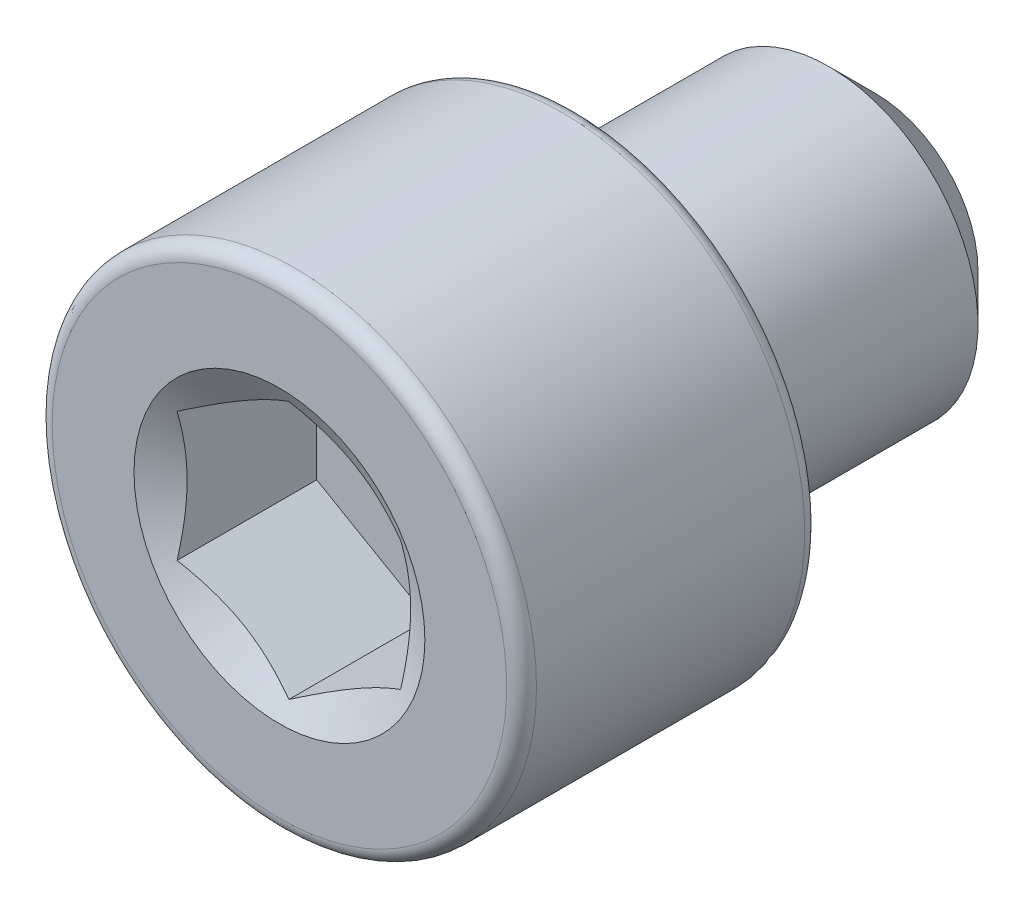
ISO-10303-21;
HEADER;
FILE_DESCRIPTION(('STEP AP214'),'2;1');
FILE_NAME('part.step','',(''),(''),'','','');
FILE_SCHEMA(('AUTOMOTIVE_DESIGN { 1 0 10303 214 1 1 1 1 }'));
ENDSEC;
DATA;
#1=APPLICATION_CONTEXT('core data for automotive mechanical design processes');
#2=APPLICATION_PROTOCOL_DEFINITION('international standard','automotive_design',2000,#1);
#3=PRODUCT_CONTEXT('',#1,'mechanical');
#4=PRODUCT('Part','Part','',(#3));
#5=PRODUCT_RELATED_PRODUCT_CATEGORY('part','',(#4));
#6=PRODUCT_DEFINITION_FORMATION('','',#4);
#7=PRODUCT_DEFINITION_CONTEXT('part definition',#1,'design');
#8=PRODUCT_DEFINITION('design','',#6,#7);
#9=PRODUCT_DEFINITION_SHAPE('','',#8);
#10=(LENGTH_UNIT() NAMED_UNIT(*) SI_UNIT(.MILLI.,.METRE.));
#11=(NAMED_UNIT(*) PLANE_ANGLE_UNIT() SI_UNIT($,.RADIAN.));
#12=(NAMED_UNIT(*) SI_UNIT($,.STERADIAN.) SOLID_ANGLE_UNIT());
#13=UNCERTAINTY_MEASURE_WITH_UNIT(LENGTH_MEASURE(1.E-05),#10,'distance_accuracy_value','');
#14=(GEOMETRIC_REPRESENTATION_CONTEXT(3) GLOBAL_UNCERTAINTY_ASSIGNED_CONTEXT((#13)) GLOBAL_UNIT_ASSIGNED_CONTEXT((#10,
#11,#12)) REPRESENTATION_CONTEXT('',''));
#15=CARTESIAN_POINT('',(0.,0.,0.));
#16=DIRECTION('',(0.,0.,1.));
#17=DIRECTION('',(1.,0.,0.));
#18=AXIS2_PLACEMENT_3D('',#15,#16,#17);
#19=CARTESIAN_POINT('',(0.,0.,-8.));
#20=DIRECTION('',(0.,0.,-1.));
#21=DIRECTION('',(-1.,0.,0.));
#22=AXIS2_PLACEMENT_3D('',#19,#20,#21);
#23=PLANE('',#22);
#24=CARTESIAN_POINT('',(0.,0.,-8.));
#25=DIRECTION('',(0.,0.,-1.));
#26=DIRECTION('',(-1.,0.,0.));
#27=AXIS2_PLACEMENT_3D('',#24,#25,#26);
#28=CIRCLE('',#27,2.75);
#29=CARTESIAN_POINT('',(-2.75,0.,-8.));
#30=VERTEX_POINT('',#29);
#31=EDGE_CURVE('E56',#30,#30,#28,.T.);
#32=ORIENTED_EDGE('',*,*,#31,.T.);
#33=EDGE_LOOP('',(#32));
#34=FACE_BOUND('',#33,.T.);
#35=ADVANCED_FACE('F43',(#34),#23,.T.);
#36=CARTESIAN_POINT('',(0.,0.,-8.));
#37=DIRECTION('',(0.,0.,1.));
#38=DIRECTION('',(1.,0.,0.));
#39=AXIS2_PLACEMENT_3D('',#36,#37,#38);
#40=CONICAL_SURFACE('',#39,2.75,0.785398163397449);
#41=CARTESIAN_POINT('',(0.,0.,-6.75));
#42=DIRECTION('',(0.,0.,-1.));
#43=DIRECTION('',(-1.,0.,0.));
#44=AXIS2_PLACEMENT_3D('',#41,#42,#43);
#45=CIRCLE('',#44,4.);
#46=CARTESIAN_POINT('',(-4.,0.,-6.75));
#47=VERTEX_POINT('',#46);
#48=EDGE_CURVE('E141',#47,#47,#45,.T.);
#49=ORIENTED_EDGE('',*,*,#48,.T.);
#50=EDGE_LOOP('',(#49));
#51=FACE_BOUND('',#50,.T.);
#52=ORIENTED_EDGE('',*,*,#31,.F.);
#53=EDGE_LOOP('',(#52));
#54=FACE_BOUND('',#53,.T.);
#55=ADVANCED_FACE('F147',(#51,#54),#40,.T.);
#56=CARTESIAN_POINT('',(0.,0.,-8.));
#57=DIRECTION('',(0.,0.,-1.));
#58=DIRECTION('',(-1.,0.,0.));
#59=AXIS2_PLACEMENT_3D('',#56,#57,#58);
#60=CYLINDRICAL_SURFACE('',#59,4.);
#61=CARTESIAN_POINT('',(0.,0.,0.));
#62=DIRECTION('',(0.,0.,-1.));
#63=DIRECTION('',(-1.,0.,0.));
#64=AXIS2_PLACEMENT_3D('',#61,#62,#63);
#65=CIRCLE('',#64,4.);
#66=CARTESIAN_POINT('',(-4.,0.,0.));
#67=VERTEX_POINT('',#66);
#68=EDGE_CURVE('E138',#67,#67,#65,.T.);
#69=ORIENTED_EDGE('',*,*,#68,.T.);
#70=EDGE_LOOP('',(#69));
#71=FACE_BOUND('',#70,.T.);
#72=ORIENTED_EDGE('',*,*,#48,.F.);
#73=EDGE_LOOP('',(#72));
#74=FACE_BOUND('',#73,.T.);
#75=ADVANCED_FACE('F149',(#71,#74),#60,.T.);
#76=CARTESIAN_POINT('',(0.,4.,0.));
#77=DIRECTION('',(0.,0.,-1.));
#78=DIRECTION('',(-1.,0.,0.));
#79=AXIS2_PLACEMENT_3D('',#76,#77,#78);
#80=PLANE('',#79);
#81=CARTESIAN_POINT('',(0.,0.,0.));
#82=DIRECTION('',(0.,0.,-1.));
#83=DIRECTION('',(-1.,0.,0.));
#84=AXIS2_PLACEMENT_3D('',#81,#82,#83);
#85=CIRCLE('',#84,6.1);
#86=CARTESIAN_POINT('',(-6.1,0.,0.));
#87=VERTEX_POINT('',#86);
#88=EDGE_CURVE('E135',#87,#87,#85,.T.);
#89=ORIENTED_EDGE('',*,*,#88,.T.);
#90=EDGE_LOOP('',(#89));
#91=FACE_BOUND('',#90,.T.);
#92=ORIENTED_EDGE('',*,*,#68,.F.);
#93=EDGE_LOOP('',(#92));
#94=FACE_BOUND('',#93,.T.);
#95=ADVANCED_FACE('F155',(#91,#94),#80,.T.);
#96=CARTESIAN_POINT('',(0.,0.,0.4));
#97=DIRECTION('',(0.,0.,-1.));
#98=DIRECTION('',(-1.,0.,0.));
#99=AXIS2_PLACEMENT_3D('',#96,#97,#98);
#100=TOROIDAL_SURFACE('',#99,6.1,0.400000000000001);
#101=CARTESIAN_POINT('',(0.,0.,0.400000000000001));
#102=DIRECTION('',(0.,0.,-1.));
#103=DIRECTION('',(-1.,0.,0.));
#104=AXIS2_PLACEMENT_3D('',#101,#102,#103);
#105=CIRCLE('',#104,6.5);
#106=CARTESIAN_POINT('',(-6.5,0.,0.400000000000001));
#107=VERTEX_POINT('',#106);
#108=EDGE_CURVE('E132',#107,#107,#105,.T.);
#109=ORIENTED_EDGE('',*,*,#108,.T.);
#110=EDGE_LOOP('',(#109));
#111=FACE_BOUND('',#110,.T.);
#112=ORIENTED_EDGE('',*,*,#88,.F.);
#113=EDGE_LOOP('',(#112));
#114=FACE_BOUND('',#113,.T.);
#115=ADVANCED_FACE('F161',(#111,#114),#100,.T.);
#116=CARTESIAN_POINT('',(0.,0.,-8.));
#117=DIRECTION('',(0.,0.,-1.));
#118=DIRECTION('',(-1.,0.,0.));
#119=AXIS2_PLACEMENT_3D('',#116,#117,#118);
#120=CYLINDRICAL_SURFACE('',#119,6.5);
#121=CARTESIAN_POINT('',(0.,0.,7.6));
#122=DIRECTION('',(0.,0.,-1.));
#123=DIRECTION('',(-1.,0.,0.));
#124=AXIS2_PLACEMENT_3D('',#121,#122,#123);
#125=CIRCLE('',#124,6.5);
#126=CARTESIAN_POINT('',(-6.5,0.,7.6));
#127=VERTEX_POINT('',#126);
#128=EDGE_CURVE('E129',#127,#127,#125,.T.);
#129=ORIENTED_EDGE('',*,*,#128,.T.);
#130=EDGE_LOOP('',(#129));
#131=FACE_BOUND('',#130,.T.);
#132=ORIENTED_EDGE('',*,*,#108,.F.);
#133=EDGE_LOOP('',(#132));
#134=FACE_BOUND('',#133,.T.);
#135=ADVANCED_FACE('F165',(#131,#134),#120,.T.);
#136=CARTESIAN_POINT('',(0.,0.,7.6));
#137=DIRECTION('',(0.,0.,-1.));
#138=DIRECTION('',(-1.,0.,0.));
#139=AXIS2_PLACEMENT_3D('',#136,#137,#138);
#140=TOROIDAL_SURFACE('',#139,6.1,0.4);
#141=CARTESIAN_POINT('',(0.,0.,8.));
#142=DIRECTION('',(0.,0.,-1.));
#143=DIRECTION('',(-1.,0.,0.));
#144=AXIS2_PLACEMENT_3D('',#141,#142,#143);
#145=CIRCLE('',#144,6.1);
#146=CARTESIAN_POINT('',(-6.1,0.,8.));
#147=VERTEX_POINT('',#146);
#148=EDGE_CURVE('E126',#147,#147,#145,.T.);
#149=ORIENTED_EDGE('',*,*,#148,.T.);
#150=EDGE_LOOP('',(#149));
#151=FACE_BOUND('',#150,.T.);
#152=ORIENTED_EDGE('',*,*,#128,.F.);
#153=EDGE_LOOP('',(#152));
#154=FACE_BOUND('',#153,.T.);
#155=ADVANCED_FACE('F169',(#151,#154),#140,.T.);
#156=CARTESIAN_POINT('',(0.,6.1,8.));
#157=DIRECTION('',(0.,0.,1.));
#158=DIRECTION('',(1.,0.,0.));
#159=AXIS2_PLACEMENT_3D('',#156,#157,#158);
#160=PLANE('',#159);
#161=CARTESIAN_POINT('',(0.,0.,8.));
#162=DIRECTION('',(0.,0.,1.));
#163=DIRECTION('',(1.,0.,0.));
#164=AXIS2_PLACEMENT_3D('',#161,#162,#163);
#165=CIRCLE('',#164,3.90341801261479);
#166=CARTESIAN_POINT('',(3.90341801261479,0.,8.));
#167=VERTEX_POINT('',#166);
#168=EDGE_CURVE('E263',#167,#167,#165,.T.);
#169=ORIENTED_EDGE('',*,*,#168,.F.);
#170=EDGE_LOOP('',(#169));
#171=FACE_BOUND('',#170,.T.);
#172=ORIENTED_EDGE('',*,*,#148,.F.);
#173=EDGE_LOOP('',(#172));
#174=FACE_BOUND('',#173,.T.);
#175=ADVANCED_FACE('F173',(#171,#174),#160,.T.);
#176=CARTESIAN_POINT('',(0.,0.,8.));
#177=DIRECTION('',(0.,0.,1.));
#178=DIRECTION('',(1.,0.,0.));
#179=AXIS2_PLACEMENT_3D('',#176,#177,#178);
#180=CONICAL_SURFACE('',#179,3.90341801261479,1.0471975511966);
#181=ORIENTED_EDGE('',*,*,#168,.T.);
#182=EDGE_LOOP('',(#181));
#183=FACE_BOUND('',#182,.T.);
#184=CARTESIAN_POINT('',(3.0002,1.73193533751504,7.7464272296571));
#185=CARTESIAN_POINT('',(2.86836479341167,1.80805042952748,7.7024650716784));
#186=CARTESIAN_POINT('',(2.73539159464475,1.88482254163057,7.66248295351872));
#187=CARTESIAN_POINT('',(2.46714257999794,2.03969618244675,7.59269344767156));
#188=CARTESIAN_POINT('',(2.33186199736566,2.11780046324563,7.56291074949147));
#189=CARTESIAN_POINT('',(2.06297739790352,2.27304105912604,7.51654920643735));
#190=CARTESIAN_POINT('',(1.92941475457054,2.35015348720802,7.49966180834904));
#191=CARTESIAN_POINT('',(1.66166094270431,2.50474122256553,7.47950100967462));
#192=CARTESIAN_POINT('',(1.52747074752016,2.58221596787771,7.47621091500717));
#193=CARTESIAN_POINT('',(1.27672440230419,2.72698443778646,7.48305189811148));
#194=CARTESIAN_POINT('',(1.16013073502732,2.79429982297457,7.49150328141871));
#195=CARTESIAN_POINT('',(0.927703015025363,2.92849202968483,7.51829031023313));
#196=CARTESIAN_POINT('',(0.811869766348668,2.99536838698943,7.53663510808781));
#197=CARTESIAN_POINT('',(0.578962742943631,3.12983731964848,7.58249611807942));
#198=CARTESIAN_POINT('',(0.461918449486059,3.19741287398332,7.61020675248918));
#199=CARTESIAN_POINT('',(0.229575649500875,3.33155605209904,7.67309916236349));
#200=CARTESIAN_POINT('',(0.114274165828893,3.39812539473502,7.70826615824765));
#201=CARTESIAN_POINT('',(-0.000200000000001032,3.46421708519159,7.7464272296571));
#202=B_SPLINE_CURVE_WITH_KNOTS('',3,(#184,#185,#186,#187,#188,#189,#190,#191,#192,#193,#194,
#195,#196,#197,#198,#199,#200,#201),.UNSPECIFIED.,.F.,.F.,(4,2,2,2,2,2,2,2,4),(0.,
0.47553983010304,0.952222784107964,1.41710776961288,1.88142182298026,2.28572436316091,
2.69040156475039,3.10405572063576,3.5168974940707),.UNSPECIFIED.);
#203=CARTESIAN_POINT('',(3.,1.73205080756888,7.74636055965722));
#204=VERTEX_POINT('',#203);
#205=CARTESIAN_POINT('',(0.,3.46410161513775,7.74636055965722));
#206=VERTEX_POINT('',#205);
#207=EDGE_CURVE('E110',#204,#206,#202,.T.);
#208=ORIENTED_EDGE('',*,*,#207,.F.);
#209=CARTESIAN_POINT('',(3.,-4.54506731839428,8.89054232543432));
#210=CARTESIAN_POINT('',(3.,-4.41484805183441,8.8278143646329));
#211=CARTESIAN_POINT('',(3.,-4.28431791596858,8.76572005028472));
#212=CARTESIAN_POINT('',(3.,-4.02247003194889,8.64315764728504));
#213=CARTESIAN_POINT('',(3.,-3.89115215270713,8.58268983902842));
#214=CARTESIAN_POINT('',(3.,-3.62683364569438,8.46341194558426));
#215=CARTESIAN_POINT('',(3.,-3.49382766470417,8.40461367968111));
#216=CARTESIAN_POINT('',(3.,-3.22671878064438,8.28957340363302));
#217=CARTESIAN_POINT('',(3.,-3.09261593336852,8.23333126440941));
#218=CARTESIAN_POINT('',(3.,-2.81931452982149,8.12254775451788));
#219=CARTESIAN_POINT('',(3.,-2.68007851372499,8.06809826650966));
#220=CARTESIAN_POINT('',(3.,-2.39993867419581,7.96358656082977));
#221=CARTESIAN_POINT('',(3.,-2.25903466042574,7.91352484943895));
#222=CARTESIAN_POINT('',(3.,-1.97563473660006,7.81918152261671));
#223=CARTESIAN_POINT('',(3.,-1.83314309138462,7.77488723097657));
#224=CARTESIAN_POINT('',(3.,-1.54612067558936,7.69356961050589));
#225=CARTESIAN_POINT('',(3.,-1.40159059644866,7.65654387686258));
#226=CARTESIAN_POINT('',(3.,-1.11113524509307,7.59178596028286));
#227=CARTESIAN_POINT('',(3.,-0.965219691534097,7.56401101769219));
#228=CARTESIAN_POINT('',(3.,-0.671693585123935,7.51941500274118));
#229=CARTESIAN_POINT('',(3.,-0.524083168991286,7.50259305307182));
#230=CARTESIAN_POINT('',(3.,-0.229783495532801,7.48146549506229));
#231=CARTESIAN_POINT('',(3.,-0.0831054463279226,7.47700756289316));
#232=CARTESIAN_POINT('',(3.,0.210108530836684,7.48059112925122));
#233=CARTESIAN_POINT('',(3.,0.356644450729305,7.48863329997832));
#234=CARTESIAN_POINT('',(3.,0.608657400165056,7.51266289889014));
#235=CARTESIAN_POINT('',(3.,0.714412415850393,7.5258787589068));
#236=CARTESIAN_POINT('',(3.,0.925072016341333,7.55793825653471));
#237=CARTESIAN_POINT('',(3.,1.02997646941285,7.57678274942358));
#238=CARTESIAN_POINT('',(3.,1.34331174127947,7.64076026093805));
#239=CARTESIAN_POINT('',(3.,1.55023819492984,7.69332375645635));
#240=CARTESIAN_POINT('',(3.,1.85967988482319,7.78353569000007));
#241=CARTESIAN_POINT('',(3.,1.96381804256063,7.81592580695245));
#242=CARTESIAN_POINT('',(3.,2.17108109849016,7.88382874485977));
#243=CARTESIAN_POINT('',(3.,2.27420598933723,7.91934158843237));
#244=CARTESIAN_POINT('',(3.,2.47948174452385,7.9929401063197));
#245=CARTESIAN_POINT('',(3.,2.58163295831665,8.03102481461068));
#246=CARTESIAN_POINT('',(3.,2.78510371294014,8.10934311062327));
#247=CARTESIAN_POINT('',(3.,2.88642326901324,8.14957665885962));
#248=CARTESIAN_POINT('',(3.,3.15048131554897,8.25714660341929));
#249=CARTESIAN_POINT('',(3.,3.31263345718718,8.32592066885235));
#250=CARTESIAN_POINT('',(3.,3.63541325712234,8.46696878575257));
#251=CARTESIAN_POINT('',(3.,3.79604078474233,8.53924313405159));
#252=CARTESIAN_POINT('',(3.,4.11610609843997,8.68648383732931));
#253=CARTESIAN_POINT('',(3.,4.27554355241526,8.76145091214));
#254=CARTESIAN_POINT('',(3.,4.59342532171062,8.91346531062927));
#255=CARTESIAN_POINT('',(3.,4.75186961263074,8.99051268517157));
#256=CARTESIAN_POINT('',(3.,5.22640745960084,9.22428629746763));
#257=CARTESIAN_POINT('',(3.,5.5412974360245,9.3834530784124));
#258=CARTESIAN_POINT('',(3.,6.16886747066862,9.70593314434638));
#259=CARTESIAN_POINT('',(3.,6.48154787837696,9.86924575393241));
#260=CARTESIAN_POINT('',(3.,7.07469625334356,10.18251723789));
#261=CARTESIAN_POINT('',(3.,7.35530580585822,10.3322084691724));
#262=CARTESIAN_POINT('',(3.,7.91562132025226,10.6333020192099));
#263=CARTESIAN_POINT('',(3.,8.19532723814926,10.7847044196857));
#264=CARTESIAN_POINT('',(3.,8.7532735641571,11.0883678377445));
#265=CARTESIAN_POINT('',(3.,9.03151588680923,11.2406253415127));
#266=CARTESIAN_POINT('',(3.,9.58743602253157,11.5461262094917));
#267=CARTESIAN_POINT('',(3.,9.86511387028088,11.6993695105725));
#268=CARTESIAN_POINT('',(3.,10.1425909492978,11.8529731275975));
#269=B_SPLINE_CURVE_WITH_KNOTS('',3,(#209,#210,#211,#212,#213,#214,#215,#216,#217,#218,#219,
#220,#221,#222,#223,#224,#225,#226,#227,#228,#229,#230,#231,#232,#233,#234,#235,#236,#237,#238,
#239,#240,#241,#242,#243,#244,#245,#246,#247,#248,#249,#250,#251,#252,#253,#254,#255,#256,#257,
#258,#259,#260,#261,#262,#263,#264,#265,#266,#267,#268),.UNSPECIFIED.,.F.,.F.,(4,2,2,2,2,2,2,2,
2,2,2,2,2,2,2,2,2,2,2,2,2,2,2,2,2,2,2,2,2,4),(0.,0.433626309213304,0.867326898705333,
1.30357421126457,1.73979946977753,2.1882540762874,2.63676035951734,3.08426360450539,
3.53161854195197,3.97687601863923,4.42209782685963,4.86180963882859,5.30154509735961,
5.62112094017843,5.94074536766137,6.58037353465766,6.90752611510541,7.2346810652894,
7.56171380833029,7.88874054416066,8.41708207462401,8.9454684883595,9.47399721968319,
10.0025388853624,11.060974830319,12.1192394366409,13.0733501638848,14.0275066510228,
14.9790349011218,15.9305028106477),.UNSPECIFIED.);
#270=CARTESIAN_POINT('',(3.,-1.73205080756888,7.74636055965721));
#271=VERTEX_POINT('',#270);
#272=EDGE_CURVE('E219',#271,#204,#269,.T.);
#273=ORIENTED_EDGE('',*,*,#272,.F.);
#274=CARTESIAN_POINT('',(-0.000199999999999749,-3.46421708519159,7.7464272296571));
#275=CARTESIAN_POINT('',(0.131635206588332,-3.38810199317915,7.7024650716784));
#276=CARTESIAN_POINT('',(0.264608405355249,-3.31132988107606,7.66248295351872));
#277=CARTESIAN_POINT('',(0.532857420002056,-3.15645624025988,7.59269344767156));
#278=CARTESIAN_POINT('',(0.668138002634341,-3.078351959461,7.56291074949147));
#279=CARTESIAN_POINT('',(0.937022602096482,-2.92311136358058,7.51654920643735));
#280=CARTESIAN_POINT('',(1.07058524542946,-2.84599893549861,7.49966180834904));
#281=CARTESIAN_POINT('',(1.33833905729569,-2.6914112001411,7.47950100967462));
#282=CARTESIAN_POINT('',(1.47252925247984,-2.61393645482892,7.47621091500717));
#283=CARTESIAN_POINT('',(1.72327559769581,-2.46916798492017,7.48305189811148));
#284=CARTESIAN_POINT('',(1.83986926497267,-2.40185259973206,7.49150328141871));
#285=CARTESIAN_POINT('',(2.07229698497464,-2.2676603930218,7.51829031023313));
#286=CARTESIAN_POINT('',(2.18813023365133,-2.2007840357172,7.53663510808781));
#287=CARTESIAN_POINT('',(2.42103725705637,-2.06631510305815,7.58249611807942));
#288=CARTESIAN_POINT('',(2.53808155051394,-1.99873954872331,7.61020675248918));
#289=CARTESIAN_POINT('',(2.77042435049912,-1.86459637060759,7.67309916236349));
#290=CARTESIAN_POINT('',(2.8857258341711,-1.79802702797161,7.70826615824765));
#291=CARTESIAN_POINT('',(3.0002,-1.73193533751504,7.7464272296571));
#292=B_SPLINE_CURVE_WITH_KNOTS('',3,(#274,#275,#276,#277,#278,#279,#280,#281,#282,#283,#284,
#285,#286,#287,#288,#289,#290,#291),.UNSPECIFIED.,.F.,.F.,(4,2,2,2,2,2,2,2,4),(0.,
0.47553983010304,0.952222784107964,1.41710776961288,1.88142182298026,2.28572436316091,
2.69040156475039,3.10405572063576,3.5168974940707),.UNSPECIFIED.);
#293=CARTESIAN_POINT('',(0.,-3.46410161513775,7.74636055965721));
#294=VERTEX_POINT('',#293);
#295=EDGE_CURVE('E213',#294,#271,#292,.T.);
#296=ORIENTED_EDGE('',*,*,#295,.F.);
#297=CARTESIAN_POINT('',(-3.0002,-1.73193533751504,7.7464272296571));
#298=CARTESIAN_POINT('',(-2.86836479341167,-1.80805042952748,7.7024650716784));
#299=CARTESIAN_POINT('',(-2.73539159464475,-1.88482254163057,7.66248295351872));
#300=CARTESIAN_POINT('',(-2.46714257999794,-2.03969618244675,7.59269344767156));
#301=CARTESIAN_POINT('',(-2.33186199736566,-2.11780046324563,7.56291074949147));
#302=CARTESIAN_POINT('',(-2.06297739790352,-2.27304105912604,7.51654920643735));
#303=CARTESIAN_POINT('',(-1.92941475457054,-2.35015348720802,7.49966180834904));
#304=CARTESIAN_POINT('',(-1.66166094270431,-2.50474122256553,7.47950100967462));
#305=CARTESIAN_POINT('',(-1.52747074752016,-2.58221596787771,7.47621091500717));
#306=CARTESIAN_POINT('',(-1.27672440230419,-2.72698443778646,7.48305189811148));
#307=CARTESIAN_POINT('',(-1.16013073502732,-2.79429982297457,7.49150328141871));
#308=CARTESIAN_POINT('',(-0.927703015025363,-2.92849202968483,7.51829031023313));
#309=CARTESIAN_POINT('',(-0.811869766348669,-2.99536838698943,7.53663510808781));
#310=CARTESIAN_POINT('',(-0.578962742943632,-3.12983731964848,7.58249611807942));
#311=CARTESIAN_POINT('',(-0.461918449486059,-3.19741287398332,7.61020675248918));
#312=CARTESIAN_POINT('',(-0.229575649500875,-3.33155605209904,7.67309916236349));
#313=CARTESIAN_POINT('',(-0.114274165828893,-3.39812539473502,7.70826615824765));
#314=CARTESIAN_POINT('',(0.000200000000000302,-3.46421708519159,7.7464272296571));
#315=B_SPLINE_CURVE_WITH_KNOTS('',3,(#297,#298,#299,#300,#301,#302,#303,#304,#305,#306,#307,
#308,#309,#310,#311,#312,#313,#314),.UNSPECIFIED.,.F.,.F.,(4,2,2,2,2,2,2,2,4),(0.,
0.47553983010304,0.952222784107964,1.41710776961288,1.88142182298026,2.28572436316091,
2.69040156475039,3.10405572063576,3.5168974940707),.UNSPECIFIED.);
#316=CARTESIAN_POINT('',(-3.,-1.73205080756888,7.74636055965722));
#317=VERTEX_POINT('',#316);
#318=EDGE_CURVE('E63',#317,#294,#315,.T.);
#319=ORIENTED_EDGE('',*,*,#318,.F.);
#320=CARTESIAN_POINT('',(-3.,-4.54506731839428,8.89054232543432));
#321=CARTESIAN_POINT('',(-3.,-4.41484805183441,8.8278143646329));
#322=CARTESIAN_POINT('',(-3.,-4.28431791596858,8.76572005028472));
#323=CARTESIAN_POINT('',(-3.,-4.02247003194889,8.64315764728504));
#324=CARTESIAN_POINT('',(-3.,-3.89115215270713,8.58268983902842));
#325=CARTESIAN_POINT('',(-3.,-3.62683364569438,8.46341194558426));
#326=CARTESIAN_POINT('',(-3.,-3.49382766470417,8.40461367968111));
#327=CARTESIAN_POINT('',(-3.,-3.22671878064438,8.28957340363302));
#328=CARTESIAN_POINT('',(-3.,-3.09261593336853,8.23333126440941));
#329=CARTESIAN_POINT('',(-3.,-2.81931452982149,8.12254775451788));
#330=CARTESIAN_POINT('',(-3.,-2.68007851372499,8.06809826650966));
#331=CARTESIAN_POINT('',(-3.,-2.39993867419581,7.96358656082977));
#332=CARTESIAN_POINT('',(-3.,-2.25903466042574,7.91352484943895));
#333=CARTESIAN_POINT('',(-3.,-1.97563473660006,7.81918152261671));
#334=CARTESIAN_POINT('',(-3.,-1.83314309138462,7.77488723097657));
#335=CARTESIAN_POINT('',(-3.,-1.54612067558936,7.69356961050589));
#336=CARTESIAN_POINT('',(-3.,-1.40159059644866,7.65654387686258));
#337=CARTESIAN_POINT('',(-3.,-1.11113524509307,7.59178596028286));
#338=CARTESIAN_POINT('',(-3.,-0.965219691534098,7.56401101769219));
#339=CARTESIAN_POINT('',(-3.,-0.671693585123936,7.51941500274118));
#340=CARTESIAN_POINT('',(-3.,-0.524083168991287,7.50259305307182));
#341=CARTESIAN_POINT('',(-3.,-0.229783495532802,7.48146549506229));
#342=CARTESIAN_POINT('',(-3.,-0.0831054463279234,7.47700756289316));
#343=CARTESIAN_POINT('',(-3.,0.210108530836683,7.48059112925122));
#344=CARTESIAN_POINT('',(-3.,0.356644450729304,7.48863329997832));
#345=CARTESIAN_POINT('',(-3.,0.608657400165056,7.51266289889014));
#346=CARTESIAN_POINT('',(-3.,0.714412415850392,7.5258787589068));
#347=CARTESIAN_POINT('',(-3.,0.925072016341332,7.55793825653471));
#348=CARTESIAN_POINT('',(-3.,1.02997646941285,7.57678274942357));
#349=CARTESIAN_POINT('',(-3.,1.34331174127947,7.64076026093805));
#350=CARTESIAN_POINT('',(-3.,1.55023819492984,7.69332375645635));
#351=CARTESIAN_POINT('',(-3.,1.85967988482318,7.78353569000007));
#352=CARTESIAN_POINT('',(-3.,1.96381804256062,7.81592580695245));
#353=CARTESIAN_POINT('',(-3.,2.17108109849016,7.88382874485977));
#354=CARTESIAN_POINT('',(-3.,2.27420598933723,7.91934158843237));
#355=CARTESIAN_POINT('',(-3.,2.47948174452385,7.9929401063197));
#356=CARTESIAN_POINT('',(-3.,2.58163295831665,8.03102481461068));
#357=CARTESIAN_POINT('',(-3.,2.78510371294014,8.10934311062327));
#358=CARTESIAN_POINT('',(-3.,2.88642326901324,8.14957665885962));
#359=CARTESIAN_POINT('',(-3.,3.15048131554897,8.25714660341929));
#360=CARTESIAN_POINT('',(-3.,3.31263345718718,8.32592066885234));
#361=CARTESIAN_POINT('',(-3.,3.63541325712234,8.46696878575257));
#362=CARTESIAN_POINT('',(-3.,3.79604078474233,8.53924313405159));
#363=CARTESIAN_POINT('',(-3.,4.11610609843997,8.68648383732931));
#364=CARTESIAN_POINT('',(-3.,4.27554355241526,8.76145091214));
#365=CARTESIAN_POINT('',(-3.,4.59342532171061,8.91346531062926));
#366=CARTESIAN_POINT('',(-3.,4.75186961263073,8.99051268517157));
#367=CARTESIAN_POINT('',(-3.,5.22640745960084,9.22428629746763));
#368=CARTESIAN_POINT('',(-3.,5.5412974360245,9.38345307841239));
#369=CARTESIAN_POINT('',(-3.,6.16886747066861,9.70593314434638));
#370=CARTESIAN_POINT('',(-3.,6.48154787837695,9.8692457539324));
#371=CARTESIAN_POINT('',(-3.,7.07469625334356,10.18251723789));
#372=CARTESIAN_POINT('',(-3.,7.35530580585822,10.3322084691724));
#373=CARTESIAN_POINT('',(-3.,7.91562132025226,10.6333020192099));
#374=CARTESIAN_POINT('',(-3.,8.19532723814926,10.7847044196857));
#375=CARTESIAN_POINT('',(-3.,8.7532735641571,11.0883678377445));
#376=CARTESIAN_POINT('',(-3.,9.03151588680923,11.2406253415127));
#377=CARTESIAN_POINT('',(-3.,9.58743602253157,11.5461262094917));
#378=CARTESIAN_POINT('',(-3.,9.86511387028089,11.6993695105725));
#379=CARTESIAN_POINT('',(-3.,10.1425909492978,11.8529731275975));
#380=B_SPLINE_CURVE_WITH_KNOTS('',3,(#320,#321,#322,#323,#324,#325,#326,#327,#328,#329,#330,
#331,#332,#333,#334,#335,#336,#337,#338,#339,#340,#341,#342,#343,#344,#345,#346,#347,#348,#349,
#350,#351,#352,#353,#354,#355,#356,#357,#358,#359,#360,#361,#362,#363,#364,#365,#366,#367,#368,
#369,#370,#371,#372,#373,#374,#375,#376,#377,#378,#379),.UNSPECIFIED.,.F.,.F.,(4,2,2,2,2,2,2,2,
2,2,2,2,2,2,2,2,2,2,2,2,2,2,2,2,2,2,2,2,2,4),(0.,0.433626309213305,0.867326898705334,
1.30357421126457,1.73979946977753,2.18825407628741,2.63676035951734,3.08426360450539,
3.53161854195197,3.97687601863923,4.42209782685963,4.86180963882859,5.30154509735962,
5.62112094017843,5.94074536766137,6.58037353465766,6.90752611510541,7.2346810652894,
7.56171380833029,7.88874054416066,8.41708207462401,8.9454684883595,9.47399721968319,
10.0025388853624,11.060974830319,12.1192394366409,13.0733501638848,14.0275066510228,
14.9790349011218,15.9305028106477),.UNSPECIFIED.);
#381=CARTESIAN_POINT('',(-3.,1.73205080756888,7.74636055965721));
#382=VERTEX_POINT('',#381);
#383=EDGE_CURVE('E11',#382,#317,#380,.F.);
#384=ORIENTED_EDGE('',*,*,#383,.F.);
#385=CARTESIAN_POINT('',(0.000199999999999258,3.46421708519159,7.7464272296571));
#386=CARTESIAN_POINT('',(-0.131635206588333,3.38810199317915,7.7024650716784));
#387=CARTESIAN_POINT('',(-0.26460840535525,3.31132988107606,7.66248295351872));
#388=CARTESIAN_POINT('',(-0.532857420002056,3.15645624025988,7.59269344767156));
#389=CARTESIAN_POINT('',(-0.668138002634341,3.078351959461,7.56291074949147));
#390=CARTESIAN_POINT('',(-0.937022602096483,2.92311136358058,7.51654920643735));
#391=CARTESIAN_POINT('',(-1.07058524542946,2.84599893549861,7.49966180834904));
#392=CARTESIAN_POINT('',(-1.33833905729569,2.6914112001411,7.47950100967462));
#393=CARTESIAN_POINT('',(-1.47252925247984,2.61393645482892,7.47621091500717));
#394=CARTESIAN_POINT('',(-1.72327559769581,2.46916798492017,7.48305189811148));
#395=CARTESIAN_POINT('',(-1.83986926497267,2.40185259973206,7.49150328141871));
#396=CARTESIAN_POINT('',(-2.07229698497464,2.2676603930218,7.51829031023313));
#397=CARTESIAN_POINT('',(-2.18813023365133,2.2007840357172,7.53663510808781));
#398=CARTESIAN_POINT('',(-2.42103725705637,2.06631510305815,7.58249611807942));
#399=CARTESIAN_POINT('',(-2.53808155051394,1.99873954872331,7.61020675248918));
#400=CARTESIAN_POINT('',(-2.77042435049912,1.86459637060759,7.67309916236349));
#401=CARTESIAN_POINT('',(-2.8857258341711,1.79802702797161,7.70826615824765));
#402=CARTESIAN_POINT('',(-3.0002,1.73193533751504,7.7464272296571));
#403=B_SPLINE_CURVE_WITH_KNOTS('',3,(#385,#386,#387,#388,#389,#390,#391,#392,#393,#394,#395,
#396,#397,#398,#399,#400,#401,#402),.UNSPECIFIED.,.F.,.F.,(4,2,2,2,2,2,2,2,4),(0.,
0.47553983010304,0.952222784107963,1.41710776961288,1.88142182298026,2.28572436316091,
2.69040156475039,3.10405572063576,3.5168974940707),.UNSPECIFIED.);
#404=EDGE_CURVE('E101',#206,#382,#403,.T.);
#405=ORIENTED_EDGE('',*,*,#404,.F.);
#406=EDGE_LOOP('',(#208,#273,#296,#319,#384,#405));
#407=FACE_BOUND('',#406,.T.);
#408=ADVANCED_FACE('F100',(#183,#407),#180,.F.);
#409=CARTESIAN_POINT('',(0.,0.,4.));
#410=DIRECTION('',(0.,0.,1.));
#411=DIRECTION('',(1.,0.,0.));
#412=AXIS2_PLACEMENT_3D('',#409,#410,#411);
#413=PLANE('',#412);
#414=DIRECTION('',(-0.866025403784438,-0.5,0.));
#415=VECTOR('',#414,1.);
#416=CARTESIAN_POINT('',(0.,3.46410161513775,4.));
#417=LINE('',#416,#415);
#418=CARTESIAN_POINT('',(0.,3.46410161513775,4.));
#419=VERTEX_POINT('',#418);
#420=CARTESIAN_POINT('',(-3.,1.73205080756888,4.));
#421=VERTEX_POINT('',#420);
#422=EDGE_CURVE('E109',#419,#421,#417,.T.);
#423=ORIENTED_EDGE('',*,*,#422,.T.);
#424=DIRECTION('',(0.,-1.,0.));
#425=VECTOR('',#424,1.);
#426=CARTESIAN_POINT('',(-3.,1.73205080756888,4.));
#427=LINE('',#426,#425);
#428=CARTESIAN_POINT('',(-3.,-1.73205080756888,4.));
#429=VERTEX_POINT('',#428);
#430=EDGE_CURVE('E114',#421,#429,#427,.T.);
#431=ORIENTED_EDGE('',*,*,#430,.T.);
#432=DIRECTION('',(0.866025403784439,-0.5,0.));
#433=VECTOR('',#432,1.);
#434=CARTESIAN_POINT('',(-3.,-1.73205080756888,4.));
#435=LINE('',#434,#433);
#436=CARTESIAN_POINT('',(0.,-3.46410161513775,4.));
#437=VERTEX_POINT('',#436);
#438=EDGE_CURVE('E245',#429,#437,#435,.T.);
#439=ORIENTED_EDGE('',*,*,#438,.T.);
#440=DIRECTION('',(0.866025403784439,0.5,0.));
#441=VECTOR('',#440,1.);
#442=CARTESIAN_POINT('',(0.,-3.46410161513775,4.));
#443=LINE('',#442,#441);
#444=CARTESIAN_POINT('',(3.,-1.73205080756888,4.));
#445=VERTEX_POINT('',#444);
#446=EDGE_CURVE('E249',#437,#445,#443,.T.);
#447=ORIENTED_EDGE('',*,*,#446,.T.);
#448=DIRECTION('',(0.,1.,0.));
#449=VECTOR('',#448,1.);
#450=CARTESIAN_POINT('',(3.,-1.73205080756888,4.));
#451=LINE('',#450,#449);
#452=CARTESIAN_POINT('',(3.,1.73205080756888,4.));
#453=VERTEX_POINT('',#452);
#454=EDGE_CURVE('E122',#445,#453,#451,.T.);
#455=ORIENTED_EDGE('',*,*,#454,.T.);
#456=DIRECTION('',(-0.866025403784439,0.5,0.));
#457=VECTOR('',#456,1.);
#458=CARTESIAN_POINT('',(3.,1.73205080756888,4.));
#459=LINE('',#458,#457);
#460=EDGE_CURVE('E117',#453,#419,#459,.T.);
#461=ORIENTED_EDGE('',*,*,#460,.T.);
#462=EDGE_LOOP('',(#423,#431,#439,#447,#455,#461));
#463=FACE_BOUND('',#462,.T.);
#464=ADVANCED_FACE('F199',(#463),#413,.T.);
#465=CARTESIAN_POINT('',(-3.,1.73205080756888,4.));
#466=DIRECTION('',(-1.,0.,0.));
#467=DIRECTION('',(0.,0.,1.));
#468=AXIS2_PLACEMENT_3D('',#465,#466,#467);
#469=PLANE('',#468);
#470=DIRECTION('',(0.,0.,1.));
#471=VECTOR('',#470,1.);
#472=CARTESIAN_POINT('',(-3.,1.73205080756888,4.));
#473=LINE('',#472,#471);
#474=EDGE_CURVE('E107',#421,#382,#473,.T.);
#475=ORIENTED_EDGE('',*,*,#474,.T.);
#476=ORIENTED_EDGE('',*,*,#383,.T.);
#477=DIRECTION('',(0.,0.,1.));
#478=VECTOR('',#477,1.);
#479=CARTESIAN_POINT('',(-3.,-1.73205080756888,4.));
#480=LINE('',#479,#478);
#481=EDGE_CURVE('E116',#429,#317,#480,.T.);
#482=ORIENTED_EDGE('',*,*,#481,.F.);
#483=ORIENTED_EDGE('',*,*,#430,.F.);
#484=EDGE_LOOP('',(#475,#476,#482,#483));
#485=FACE_BOUND('',#484,.T.);
#486=ADVANCED_FACE('F112',(#485),#469,.F.);
#487=CARTESIAN_POINT('',(-3.,-1.73205080756888,4.));
#488=DIRECTION('',(-0.5,-0.866025403784439,0.));
#489=DIRECTION('',(0.866025403784439,-0.5,0.));
#490=AXIS2_PLACEMENT_3D('',#487,#488,#489);
#491=PLANE('',#490);
#492=ORIENTED_EDGE('',*,*,#481,.T.);
#493=ORIENTED_EDGE('',*,*,#318,.T.);
#494=DIRECTION('',(0.,0.,1.));
#495=VECTOR('',#494,1.);
#496=CARTESIAN_POINT('',(0.,-3.46410161513775,4.));
#497=LINE('',#496,#495);
#498=EDGE_CURVE('E119',#437,#294,#497,.T.);
#499=ORIENTED_EDGE('',*,*,#498,.F.);
#500=ORIENTED_EDGE('',*,*,#438,.F.);
#501=EDGE_LOOP('',(#492,#493,#499,#500));
#502=FACE_BOUND('',#501,.T.);
#503=ADVANCED_FACE('F234',(#502),#491,.F.);
#504=CARTESIAN_POINT('',(0.,-3.46410161513775,4.));
#505=DIRECTION('',(0.5,-0.866025403784439,0.));
#506=DIRECTION('',(0.866025403784439,0.5,0.));
#507=AXIS2_PLACEMENT_3D('',#504,#505,#506);
#508=PLANE('',#507);
#509=ORIENTED_EDGE('',*,*,#498,.T.);
#510=ORIENTED_EDGE('',*,*,#295,.T.);
#511=DIRECTION('',(0.,0.,1.));
#512=VECTOR('',#511,1.);
#513=CARTESIAN_POINT('',(3.,-1.73205080756888,4.));
#514=LINE('',#513,#512);
#515=EDGE_CURVE('E259',#445,#271,#514,.T.);
#516=ORIENTED_EDGE('',*,*,#515,.F.);
#517=ORIENTED_EDGE('',*,*,#446,.F.);
#518=EDGE_LOOP('',(#509,#510,#516,#517));
#519=FACE_BOUND('',#518,.T.);
#520=ADVANCED_FACE('F229',(#519),#508,.F.);
#521=CARTESIAN_POINT('',(3.,-1.73205080756888,4.));
#522=DIRECTION('',(1.,0.,0.));
#523=DIRECTION('',(0.,0.,-1.));
#524=AXIS2_PLACEMENT_3D('',#521,#522,#523);
#525=PLANE('',#524);
#526=ORIENTED_EDGE('',*,*,#515,.T.);
#527=ORIENTED_EDGE('',*,*,#272,.T.);
#528=DIRECTION('',(0.,0.,1.));
#529=VECTOR('',#528,1.);
#530=CARTESIAN_POINT('',(3.,1.73205080756888,4.));
#531=LINE('',#530,#529);
#532=EDGE_CURVE('E256',#453,#204,#531,.T.);
#533=ORIENTED_EDGE('',*,*,#532,.F.);
#534=ORIENTED_EDGE('',*,*,#454,.F.);
#535=EDGE_LOOP('',(#526,#527,#533,#534));
#536=FACE_BOUND('',#535,.T.);
#537=ADVANCED_FACE('F226',(#536),#525,.F.);
#538=CARTESIAN_POINT('',(3.,1.73205080756888,4.));
#539=DIRECTION('',(0.5,0.866025403784439,0.));
#540=DIRECTION('',(-0.866025403784439,0.5,0.));
#541=AXIS2_PLACEMENT_3D('',#538,#539,#540);
#542=PLANE('',#541);
#543=ORIENTED_EDGE('',*,*,#532,.T.);
#544=ORIENTED_EDGE('',*,*,#207,.T.);
#545=DIRECTION('',(0.,0.,1.));
#546=VECTOR('',#545,1.);
#547=CARTESIAN_POINT('',(0.,3.46410161513775,4.));
#548=LINE('',#547,#546);
#549=EDGE_CURVE('E70',#419,#206,#548,.T.);
#550=ORIENTED_EDGE('',*,*,#549,.F.);
#551=ORIENTED_EDGE('',*,*,#460,.F.);
#552=EDGE_LOOP('',(#543,#544,#550,#551));
#553=FACE_BOUND('',#552,.T.);
#554=ADVANCED_FACE('F180',(#553),#542,.F.);
#555=CARTESIAN_POINT('',(0.,3.46410161513775,4.));
#556=DIRECTION('',(-0.5,0.866025403784438,0.));
#557=DIRECTION('',(-0.866025403784438,-0.5,0.));
#558=AXIS2_PLACEMENT_3D('',#555,#556,#557);
#559=PLANE('',#558);
#560=ORIENTED_EDGE('',*,*,#549,.T.);
#561=ORIENTED_EDGE('',*,*,#404,.T.);
#562=ORIENTED_EDGE('',*,*,#474,.F.);
#563=ORIENTED_EDGE('',*,*,#422,.F.);
#564=EDGE_LOOP('',(#560,#561,#562,#563));
#565=FACE_BOUND('',#564,.T.);
#566=ADVANCED_FACE('F106',(#565),#559,.F.);
#567=CLOSED_SHELL('',(#35,#55,#75,#95,#115,#135,#155,#175,#408,#464,#486,#503,#520,#537,#554,#566));
#568=MANIFOLD_SOLID_BREP('B2',#567);
#569=ADVANCED_BREP_SHAPE_REPRESENTATION('',(#18,#568),#14);
#570=SHAPE_DEFINITION_REPRESENTATION(#9,#569);
ENDSEC;
END-ISO-10303-21;
